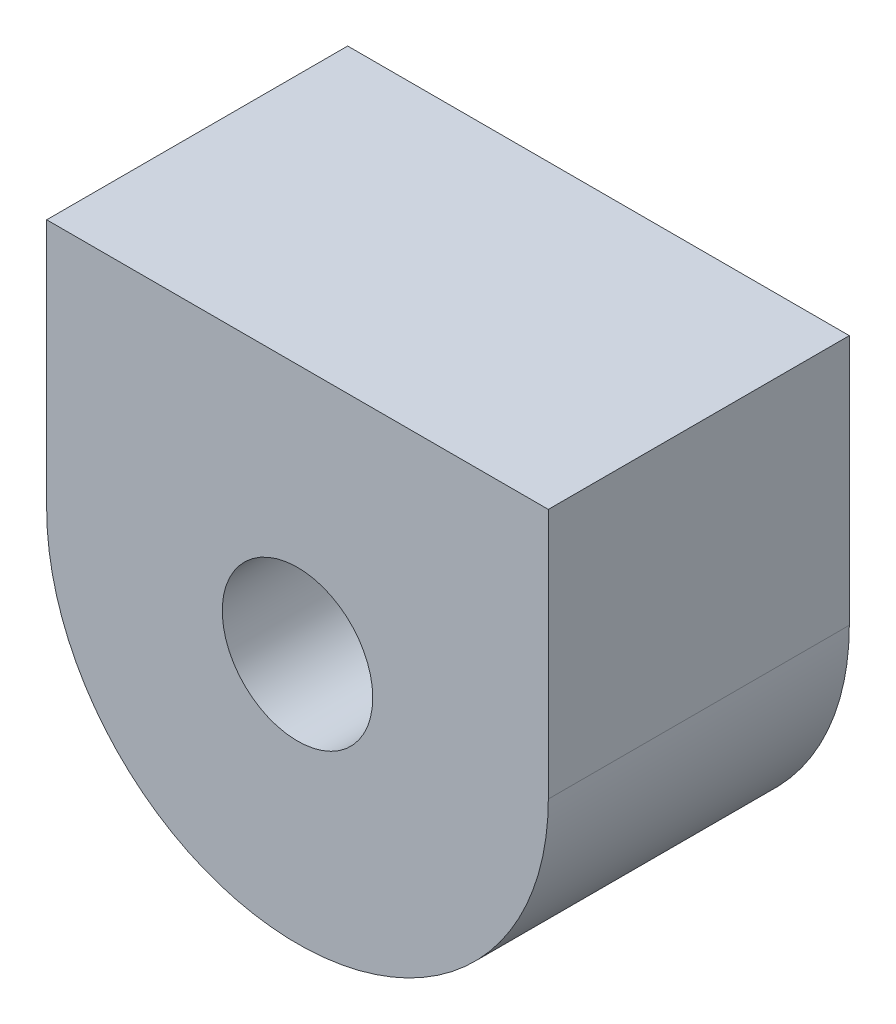
ISO-10303-21;
HEADER;
FILE_DESCRIPTION(('STEP AP214'),'2;1');
FILE_NAME('part.step','',(''),(''),'','','');
FILE_SCHEMA(('AUTOMOTIVE_DESIGN { 1 0 10303 214 1 1 1 1 }'));
ENDSEC;
DATA;
#1=APPLICATION_CONTEXT('core data for automotive mechanical design processes');
#2=APPLICATION_PROTOCOL_DEFINITION('international standard','automotive_design',2000,#1);
#3=PRODUCT_CONTEXT('',#1,'mechanical');
#4=PRODUCT('Part','Part','',(#3));
#5=PRODUCT_RELATED_PRODUCT_CATEGORY('part','',(#4));
#6=PRODUCT_DEFINITION_FORMATION('','',#4);
#7=PRODUCT_DEFINITION_CONTEXT('part definition',#1,'design');
#8=PRODUCT_DEFINITION('design','',#6,#7);
#9=PRODUCT_DEFINITION_SHAPE('','',#8);
#10=(LENGTH_UNIT() NAMED_UNIT(*) SI_UNIT(.MILLI.,.METRE.));
#11=(NAMED_UNIT(*) PLANE_ANGLE_UNIT() SI_UNIT($,.RADIAN.));
#12=(NAMED_UNIT(*) SI_UNIT($,.STERADIAN.) SOLID_ANGLE_UNIT());
#13=UNCERTAINTY_MEASURE_WITH_UNIT(LENGTH_MEASURE(1.E-05),#10,'distance_accuracy_value','');
#14=(GEOMETRIC_REPRESENTATION_CONTEXT(3) GLOBAL_UNCERTAINTY_ASSIGNED_CONTEXT((#13)) GLOBAL_UNIT_ASSIGNED_CONTEXT((#10,
#11,#12)) REPRESENTATION_CONTEXT('',''));
#15=CARTESIAN_POINT('',(0.,0.,0.));
#16=DIRECTION('',(0.,0.,1.));
#17=DIRECTION('',(1.,0.,0.));
#18=AXIS2_PLACEMENT_3D('',#15,#16,#17);
#19=CARTESIAN_POINT('',(5.,0.,6.));
#20=DIRECTION('',(0.,0.,1.));
#21=DIRECTION('',(1.,0.,0.));
#22=AXIS2_PLACEMENT_3D('',#19,#20,#21);
#23=PLANE('',#22);
#24=CARTESIAN_POINT('',(5.,0.,6.));
#25=DIRECTION('',(0.,0.,1.));
#26=DIRECTION('',(1.,0.,0.));
#27=AXIS2_PLACEMENT_3D('',#24,#25,#26);
#28=CIRCLE('',#27,5.);
#29=CARTESIAN_POINT('',(0.,0.,6.));
#30=VERTEX_POINT('',#29);
#31=CARTESIAN_POINT('',(10.,0.,6.));
#32=VERTEX_POINT('',#31);
#33=EDGE_CURVE('E85',#30,#32,#28,.T.);
#34=ORIENTED_EDGE('',*,*,#33,.T.);
#35=DIRECTION('',(0.,1.,0.));
#36=VECTOR('',#35,1.);
#37=CARTESIAN_POINT('',(10.,5.,6.));
#38=LINE('',#37,#36);
#39=CARTESIAN_POINT('',(10.,5.,6.));
#40=VERTEX_POINT('',#39);
#41=EDGE_CURVE('E80',#32,#40,#38,.T.);
#42=ORIENTED_EDGE('',*,*,#41,.T.);
#43=DIRECTION('',(-1.,0.,0.));
#44=VECTOR('',#43,1.);
#45=CARTESIAN_POINT('',(0.,5.,6.));
#46=LINE('',#45,#44);
#47=CARTESIAN_POINT('',(0.,5.,6.));
#48=VERTEX_POINT('',#47);
#49=EDGE_CURVE('E83',#40,#48,#46,.T.);
#50=ORIENTED_EDGE('',*,*,#49,.T.);
#51=DIRECTION('',(0.,-1.,0.));
#52=VECTOR('',#51,1.);
#53=CARTESIAN_POINT('',(0.,0.,6.));
#54=LINE('',#53,#52);
#55=EDGE_CURVE('E50',#48,#30,#54,.T.);
#56=ORIENTED_EDGE('',*,*,#55,.T.);
#57=EDGE_LOOP('',(#34,#42,#50,#56));
#58=FACE_BOUND('',#57,.T.);
#59=CARTESIAN_POINT('',(5.,0.,6.));
#60=DIRECTION('',(0.,0.,1.));
#61=DIRECTION('',(1.,0.,0.));
#62=AXIS2_PLACEMENT_3D('',#59,#60,#61);
#63=CIRCLE('',#62,1.5);
#64=CARTESIAN_POINT('',(6.5,0.,6.));
#65=VERTEX_POINT('',#64);
#66=EDGE_CURVE('E100',#65,#65,#63,.T.);
#67=ORIENTED_EDGE('',*,*,#66,.F.);
#68=EDGE_LOOP('',(#67));
#69=FACE_BOUND('',#68,.T.);
#70=ADVANCED_FACE('F33',(#58,#69),#23,.T.);
#71=CARTESIAN_POINT('',(5.,0.,0.));
#72=DIRECTION('',(0.,0.,1.));
#73=DIRECTION('',(1.,0.,0.));
#74=AXIS2_PLACEMENT_3D('',#71,#72,#73);
#75=PLANE('',#74);
#76=CARTESIAN_POINT('',(5.,0.,0.));
#77=DIRECTION('',(0.,0.,1.));
#78=DIRECTION('',(1.,0.,0.));
#79=AXIS2_PLACEMENT_3D('',#76,#77,#78);
#80=CIRCLE('',#79,5.);
#81=CARTESIAN_POINT('',(0.,0.,0.));
#82=VERTEX_POINT('',#81);
#83=CARTESIAN_POINT('',(10.,0.,0.));
#84=VERTEX_POINT('',#83);
#85=EDGE_CURVE('E97',#82,#84,#80,.T.);
#86=ORIENTED_EDGE('',*,*,#85,.F.);
#87=DIRECTION('',(0.,-1.,0.));
#88=VECTOR('',#87,1.);
#89=CARTESIAN_POINT('',(0.,0.,0.));
#90=LINE('',#89,#88);
#91=CARTESIAN_POINT('',(0.,5.,0.));
#92=VERTEX_POINT('',#91);
#93=EDGE_CURVE('E73',#92,#82,#90,.T.);
#94=ORIENTED_EDGE('',*,*,#93,.F.);
#95=DIRECTION('',(-1.,0.,0.));
#96=VECTOR('',#95,1.);
#97=CARTESIAN_POINT('',(0.,5.,0.));
#98=LINE('',#97,#96);
#99=CARTESIAN_POINT('',(10.,5.,0.));
#100=VERTEX_POINT('',#99);
#101=EDGE_CURVE('E67',#100,#92,#98,.T.);
#102=ORIENTED_EDGE('',*,*,#101,.F.);
#103=DIRECTION('',(0.,1.,0.));
#104=VECTOR('',#103,1.);
#105=CARTESIAN_POINT('',(10.,5.,0.));
#106=LINE('',#105,#104);
#107=EDGE_CURVE('E89',#84,#100,#106,.T.);
#108=ORIENTED_EDGE('',*,*,#107,.F.);
#109=EDGE_LOOP('',(#86,#94,#102,#108));
#110=FACE_BOUND('',#109,.T.);
#111=CARTESIAN_POINT('',(5.,0.,0.));
#112=DIRECTION('',(0.,0.,1.));
#113=DIRECTION('',(1.,0.,0.));
#114=AXIS2_PLACEMENT_3D('',#111,#112,#113);
#115=CIRCLE('',#114,1.5);
#116=CARTESIAN_POINT('',(6.5,0.,0.));
#117=VERTEX_POINT('',#116);
#118=EDGE_CURVE('E112',#117,#117,#115,.T.);
#119=ORIENTED_EDGE('',*,*,#118,.T.);
#120=EDGE_LOOP('',(#119));
#121=FACE_BOUND('',#120,.T.);
#122=ADVANCED_FACE('F108',(#110,#121),#75,.F.);
#123=CARTESIAN_POINT('',(5.,0.,6.));
#124=DIRECTION('',(0.,0.,-1.));
#125=DIRECTION('',(-1.,0.,0.));
#126=AXIS2_PLACEMENT_3D('',#123,#124,#125);
#127=CYLINDRICAL_SURFACE('',#126,5.);
#128=ORIENTED_EDGE('',*,*,#85,.T.);
#129=DIRECTION('',(0.,0.,-1.));
#130=VECTOR('',#129,1.);
#131=CARTESIAN_POINT('',(10.,0.,6.));
#132=LINE('',#131,#130);
#133=EDGE_CURVE('E11',#32,#84,#132,.T.);
#134=ORIENTED_EDGE('',*,*,#133,.F.);
#135=ORIENTED_EDGE('',*,*,#33,.F.);
#136=DIRECTION('',(0.,0.,-1.));
#137=VECTOR('',#136,1.);
#138=CARTESIAN_POINT('',(0.,0.,6.));
#139=LINE('',#138,#137);
#140=EDGE_CURVE('E93',#30,#82,#139,.T.);
#141=ORIENTED_EDGE('',*,*,#140,.T.);
#142=EDGE_LOOP('',(#128,#134,#135,#141));
#143=FACE_BOUND('',#142,.T.);
#144=ADVANCED_FACE('F35',(#143),#127,.T.);
#145=CARTESIAN_POINT('',(10.,5.,6.));
#146=DIRECTION('',(-1.,0.,0.));
#147=DIRECTION('',(0.,-1.,0.));
#148=AXIS2_PLACEMENT_3D('',#145,#146,#147);
#149=PLANE('',#148);
#150=ORIENTED_EDGE('',*,*,#107,.T.);
#151=DIRECTION('',(0.,0.,-1.));
#152=VECTOR('',#151,1.);
#153=CARTESIAN_POINT('',(10.,5.,6.));
#154=LINE('',#153,#152);
#155=EDGE_CURVE('E42',#40,#100,#154,.T.);
#156=ORIENTED_EDGE('',*,*,#155,.F.);
#157=ORIENTED_EDGE('',*,*,#41,.F.);
#158=ORIENTED_EDGE('',*,*,#133,.T.);
#159=EDGE_LOOP('',(#150,#156,#157,#158));
#160=FACE_BOUND('',#159,.T.);
#161=ADVANCED_FACE('F88',(#160),#149,.F.);
#162=CARTESIAN_POINT('',(0.,5.,6.));
#163=DIRECTION('',(0.,-1.,0.));
#164=DIRECTION('',(0.,0.,-1.));
#165=AXIS2_PLACEMENT_3D('',#162,#163,#164);
#166=PLANE('',#165);
#167=ORIENTED_EDGE('',*,*,#101,.T.);
#168=DIRECTION('',(0.,0.,-1.));
#169=VECTOR('',#168,1.);
#170=CARTESIAN_POINT('',(0.,5.,6.));
#171=LINE('',#170,#169);
#172=EDGE_CURVE('E90',#48,#92,#171,.T.);
#173=ORIENTED_EDGE('',*,*,#172,.F.);
#174=ORIENTED_EDGE('',*,*,#49,.F.);
#175=ORIENTED_EDGE('',*,*,#155,.T.);
#176=EDGE_LOOP('',(#167,#173,#174,#175));
#177=FACE_BOUND('',#176,.T.);
#178=ADVANCED_FACE('F91',(#177),#166,.F.);
#179=CARTESIAN_POINT('',(0.,0.,6.));
#180=DIRECTION('',(1.,0.,0.));
#181=DIRECTION('',(0.,1.,0.));
#182=AXIS2_PLACEMENT_3D('',#179,#180,#181);
#183=PLANE('',#182);
#184=ORIENTED_EDGE('',*,*,#93,.T.);
#185=ORIENTED_EDGE('',*,*,#140,.F.);
#186=ORIENTED_EDGE('',*,*,#55,.F.);
#187=ORIENTED_EDGE('',*,*,#172,.T.);
#188=EDGE_LOOP('',(#184,#185,#186,#187));
#189=FACE_BOUND('',#188,.T.);
#190=ADVANCED_FACE('F105',(#189),#183,.F.);
#191=CARTESIAN_POINT('',(5.,0.,6.));
#192=DIRECTION('',(0.,0.,-1.));
#193=DIRECTION('',(-1.,0.,0.));
#194=AXIS2_PLACEMENT_3D('',#191,#192,#193);
#195=CYLINDRICAL_SURFACE('',#194,1.5);
#196=ORIENTED_EDGE('',*,*,#66,.T.);
#197=EDGE_LOOP('',(#196));
#198=FACE_BOUND('',#197,.T.);
#199=ORIENTED_EDGE('',*,*,#118,.F.);
#200=EDGE_LOOP('',(#199));
#201=FACE_BOUND('',#200,.T.);
#202=ADVANCED_FACE('F118',(#198,#201),#195,.F.);
#203=CLOSED_SHELL('',(#70,#122,#144,#161,#178,#190,#202));
#204=MANIFOLD_SOLID_BREP('B2',#203);
#205=ADVANCED_BREP_SHAPE_REPRESENTATION('',(#18,#204),#14);
#206=SHAPE_DEFINITION_REPRESENTATION(#9,#205);
ENDSEC;
END-ISO-10303-21;
